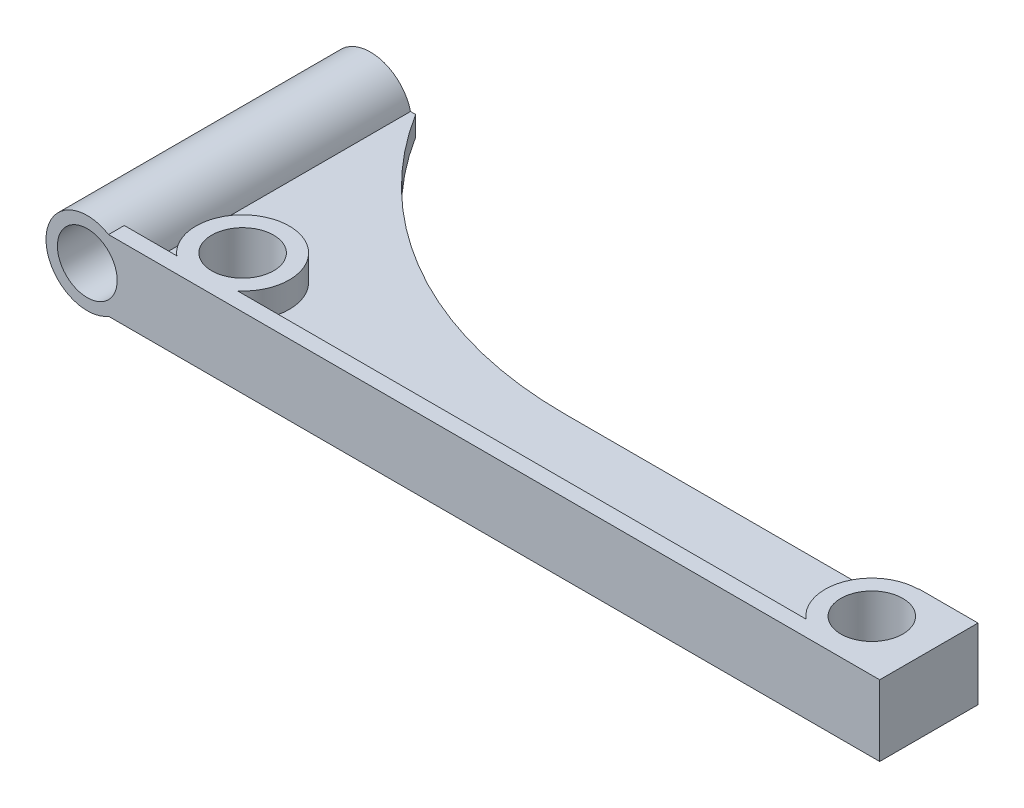
ISO-10303-21;
HEADER;
FILE_DESCRIPTION(('STEP AP214'),'2;1');
FILE_NAME('part.step','',(''),(''),'','','');
FILE_SCHEMA(('AUTOMOTIVE_DESIGN { 1 0 10303 214 1 1 1 1 }'));
ENDSEC;
DATA;
#1=APPLICATION_CONTEXT('core data for automotive mechanical design processes');
#2=APPLICATION_PROTOCOL_DEFINITION('international standard','automotive_design',2000,#1);
#3=PRODUCT_CONTEXT('',#1,'mechanical');
#4=PRODUCT('Part','Part','',(#3));
#5=PRODUCT_RELATED_PRODUCT_CATEGORY('part','',(#4));
#6=PRODUCT_DEFINITION_FORMATION('','',#4);
#7=PRODUCT_DEFINITION_CONTEXT('part definition',#1,'design');
#8=PRODUCT_DEFINITION('design','',#6,#7);
#9=PRODUCT_DEFINITION_SHAPE('','',#8);
#10=(LENGTH_UNIT() NAMED_UNIT(*) SI_UNIT(.MILLI.,.METRE.));
#11=(NAMED_UNIT(*) PLANE_ANGLE_UNIT() SI_UNIT($,.RADIAN.));
#12=(NAMED_UNIT(*) SI_UNIT($,.STERADIAN.) SOLID_ANGLE_UNIT());
#13=UNCERTAINTY_MEASURE_WITH_UNIT(LENGTH_MEASURE(1.E-05),#10,'distance_accuracy_value','');
#14=(GEOMETRIC_REPRESENTATION_CONTEXT(3) GLOBAL_UNCERTAINTY_ASSIGNED_CONTEXT((#13)) GLOBAL_UNIT_ASSIGNED_CONTEXT((#10,
#11,#12)) REPRESENTATION_CONTEXT('',''));
#15=CARTESIAN_POINT('',(0.,0.,0.));
#16=DIRECTION('',(0.,0.,1.));
#17=DIRECTION('',(1.,0.,0.));
#18=AXIS2_PLACEMENT_3D('',#15,#16,#17);
#19=CARTESIAN_POINT('',(0.,0.,-3.99999999999999));
#20=DIRECTION('',(0.,0.,-1.));
#21=DIRECTION('',(-1.,0.,0.));
#22=AXIS2_PLACEMENT_3D('',#19,#20,#21);
#23=PLANE('',#22);
#24=DIRECTION('',(0.,-1.,0.));
#25=VECTOR('',#24,1.);
#26=CARTESIAN_POINT('',(178.753024783827,9.,-3.99999999999999));
#27=LINE('',#26,#25);
#28=CARTESIAN_POINT('',(178.753024783827,2.5,-3.99999999999998));
#29=VERTEX_POINT('',#28);
#30=CARTESIAN_POINT('',(178.753024783827,9.,-3.99999999999998));
#31=VERTEX_POINT('',#30);
#32=EDGE_CURVE('E224',#29,#31,#27,.F.);
#33=ORIENTED_EDGE('',*,*,#32,.F.);
#34=DIRECTION('',(-1.,0.,0.));
#35=VECTOR('',#34,1.);
#36=CARTESIAN_POINT('',(0.,2.5,-3.99999999999999));
#37=LINE('',#36,#35);
#38=CARTESIAN_POINT('',(34.2469752161731,2.5,-3.99999999999999));
#39=VERTEX_POINT('',#38);
#40=EDGE_CURVE('E290',#29,#39,#37,.T.);
#41=ORIENTED_EDGE('',*,*,#40,.T.);
#42=DIRECTION('',(0.,-1.,0.));
#43=VECTOR('',#42,1.);
#44=CARTESIAN_POINT('',(34.2469752161731,9.,-3.99999999999999));
#45=LINE('',#44,#43);
#46=CARTESIAN_POINT('',(34.2469752161731,9.,-3.99999999999999));
#47=VERTEX_POINT('',#46);
#48=EDGE_CURVE('E12',#47,#39,#45,.T.);
#49=ORIENTED_EDGE('',*,*,#48,.F.);
#50=DIRECTION('',(1.,0.,0.));
#51=VECTOR('',#50,1.);
#52=CARTESIAN_POINT('',(0.,9.,-3.99999999999999));
#53=LINE('',#52,#51);
#54=EDGE_CURVE('E295',#47,#31,#53,.T.);
#55=ORIENTED_EDGE('',*,*,#54,.T.);
#56=EDGE_LOOP('',(#33,#41,#49,#55));
#57=FACE_BOUND('',#56,.T.);
#58=ADVANCED_FACE('F57',(#57),#23,.T.);
#59=CARTESIAN_POINT('',(0.,-2.5,-3.99999999999999));
#60=DIRECTION('',(0.,-1.,0.));
#61=DIRECTION('',(0.,0.,-1.));
#62=AXIS2_PLACEMENT_3D('',#59,#60,#61);
#63=PLANE('',#62);
#64=DIRECTION('',(-1.,0.,0.));
#65=VECTOR('',#64,1.);
#66=CARTESIAN_POINT('',(0.,-2.5,-25.));
#67=LINE('',#66,#65);
#68=CARTESIAN_POINT('',(186.5,-2.5,-25.));
#69=VERTEX_POINT('',#68);
#70=CARTESIAN_POINT('',(96.2997641506154,-2.5,-25.));
#71=VERTEX_POINT('',#70);
#72=EDGE_CURVE('E322',#69,#71,#67,.T.);
#73=ORIENTED_EDGE('',*,*,#72,.F.);
#74=DIRECTION('',(0.,0.,-1.));
#75=VECTOR('',#74,1.);
#76=CARTESIAN_POINT('',(186.5,-2.5,-25.));
#77=LINE('',#76,#75);
#78=CARTESIAN_POINT('',(186.5,-2.5,-24.875));
#79=VERTEX_POINT('',#78);
#80=EDGE_CURVE('E234',#79,#69,#77,.T.);
#81=ORIENTED_EDGE('',*,*,#80,.F.);
#82=CARTESIAN_POINT('',(186.5,-2.5,-13.));
#83=DIRECTION('',(0.,-1.,0.));
#84=DIRECTION('',(1.,0.,0.));
#85=AXIS2_PLACEMENT_3D('',#82,#83,#84);
#86=CIRCLE('',#85,11.875);
#87=CARTESIAN_POINT('',(178.753024783827,-2.5,-3.99999999999998));
#88=VERTEX_POINT('',#87);
#89=EDGE_CURVE('E250',#88,#79,#86,.T.);
#90=ORIENTED_EDGE('',*,*,#89,.F.);
#91=DIRECTION('',(-1.,0.,0.));
#92=VECTOR('',#91,1.);
#93=CARTESIAN_POINT('',(0.,-2.5,-3.99999999999999));
#94=LINE('',#93,#92);
#95=CARTESIAN_POINT('',(34.2469752161731,-2.5,-3.99999999999999));
#96=VERTEX_POINT('',#95);
#97=EDGE_CURVE('E276',#88,#96,#94,.T.);
#98=ORIENTED_EDGE('',*,*,#97,.T.);
#99=CARTESIAN_POINT('',(26.5,-2.5,-13.));
#100=DIRECTION('',(0.,-1.,0.));
#101=DIRECTION('',(1.,0.,0.));
#102=AXIS2_PLACEMENT_3D('',#99,#100,#101);
#103=CIRCLE('',#102,11.875);
#104=CARTESIAN_POINT('',(18.7530247838269,-2.5,-3.99999999999999));
#105=VERTEX_POINT('',#104);
#106=EDGE_CURVE('E262',#105,#96,#103,.T.);
#107=ORIENTED_EDGE('',*,*,#106,.F.);
#108=CARTESIAN_POINT('',(10.1980390271856,-2.5,-3.99999999999999));
#109=VERTEX_POINT('',#108);
#110=EDGE_CURVE('E279',#105,#109,#94,.T.);
#111=ORIENTED_EDGE('',*,*,#110,.T.);
#112=DIRECTION('',(0.,0.,-1.));
#113=VECTOR('',#112,1.);
#114=CARTESIAN_POINT('',(10.1980390271856,-2.5,-3.99999999999999));
#115=LINE('',#114,#113);
#116=CARTESIAN_POINT('',(10.1980390271856,-2.5,-72.));
#117=VERTEX_POINT('',#116);
#118=EDGE_CURVE('E285',#109,#117,#115,.T.);
#119=ORIENTED_EDGE('',*,*,#118,.T.);
#120=DIRECTION('',(-1.,0.,0.));
#121=VECTOR('',#120,1.);
#122=CARTESIAN_POINT('',(0.,-2.5,-72.));
#123=LINE('',#122,#121);
#124=CARTESIAN_POINT('',(11.5,-2.5,-72.));
#125=VERTEX_POINT('',#124);
#126=EDGE_CURVE('E273',#125,#117,#123,.T.);
#127=ORIENTED_EDGE('',*,*,#126,.F.);
#128=CARTESIAN_POINT('',(96.2997641506154,-2.5,-125.));
#129=DIRECTION('',(0.,-1.,0.));
#130=DIRECTION('',(0.,0.,-1.));
#131=AXIS2_PLACEMENT_3D('',#128,#129,#130);
#132=CIRCLE('',#131,100.);
#133=EDGE_CURVE('E326',#71,#125,#132,.T.);
#134=ORIENTED_EDGE('',*,*,#133,.F.);
#135=EDGE_LOOP('',(#73,#81,#90,#98,#107,#111,#119,#127,#134));
#136=FACE_BOUND('',#135,.T.);
#137=ADVANCED_FACE('F368',(#136),#63,.T.);
#138=CARTESIAN_POINT('',(186.5,-9.,-13.));
#139=DIRECTION('',(0.,1.,0.));
#140=DIRECTION('',(0.,0.,1.));
#141=AXIS2_PLACEMENT_3D('',#138,#139,#140);
#142=CYLINDRICAL_SURFACE('',#141,11.875);
#143=DIRECTION('',(0.,1.,0.));
#144=VECTOR('',#143,1.);
#145=CARTESIAN_POINT('',(186.5,-9.,-24.875));
#146=LINE('',#145,#144);
#147=CARTESIAN_POINT('',(186.5,-9.,-24.875));
#148=VERTEX_POINT('',#147);
#149=EDGE_CURVE('E245',#148,#79,#146,.T.);
#150=ORIENTED_EDGE('',*,*,#149,.F.);
#151=CARTESIAN_POINT('',(186.5,-9.,-13.));
#152=DIRECTION('',(0.,-1.,0.));
#153=DIRECTION('',(1.,0.,0.));
#154=AXIS2_PLACEMENT_3D('',#151,#152,#153);
#155=CIRCLE('',#154,11.875);
#156=CARTESIAN_POINT('',(178.753024783827,-9.,-3.99999999999998));
#157=VERTEX_POINT('',#156);
#158=EDGE_CURVE('E251',#157,#148,#155,.T.);
#159=ORIENTED_EDGE('',*,*,#158,.F.);
#160=DIRECTION('',(0.,1.,0.));
#161=VECTOR('',#160,1.);
#162=CARTESIAN_POINT('',(178.753024783827,-9.,-3.99999999999999));
#163=LINE('',#162,#161);
#164=EDGE_CURVE('E254',#88,#157,#163,.F.);
#165=ORIENTED_EDGE('',*,*,#164,.F.);
#166=ORIENTED_EDGE('',*,*,#89,.T.);
#167=EDGE_LOOP('',(#150,#159,#165,#166));
#168=FACE_BOUND('',#167,.T.);
#169=ADVANCED_FACE('F393',(#168),#142,.T.);
#170=CARTESIAN_POINT('',(0.,0.,-3.99999999999999));
#171=DIRECTION('',(0.,0.,-1.));
#172=DIRECTION('',(-1.,0.,0.));
#173=AXIS2_PLACEMENT_3D('',#170,#171,#172);
#174=PLANE('',#173);
#175=ORIENTED_EDGE('',*,*,#97,.F.);
#176=ORIENTED_EDGE('',*,*,#164,.T.);
#177=DIRECTION('',(1.,0.,0.));
#178=VECTOR('',#177,1.);
#179=CARTESIAN_POINT('',(0.,-9.,-3.99999999999999));
#180=LINE('',#179,#178);
#181=CARTESIAN_POINT('',(34.2469752161731,-9.,-3.99999999999999));
#182=VERTEX_POINT('',#181);
#183=EDGE_CURVE('E278',#182,#157,#180,.T.);
#184=ORIENTED_EDGE('',*,*,#183,.F.);
#185=DIRECTION('',(0.,1.,0.));
#186=VECTOR('',#185,1.);
#187=CARTESIAN_POINT('',(34.2469752161731,-9.,-3.99999999999999));
#188=LINE('',#187,#186);
#189=EDGE_CURVE('E328',#182,#96,#188,.T.);
#190=ORIENTED_EDGE('',*,*,#189,.T.);
#191=EDGE_LOOP('',(#175,#176,#184,#190));
#192=FACE_BOUND('',#191,.T.);
#193=ADVANCED_FACE('F452',(#192),#174,.T.);
#194=ORIENTED_EDGE('',*,*,#110,.F.);
#195=DIRECTION('',(0.,1.,0.));
#196=VECTOR('',#195,1.);
#197=CARTESIAN_POINT('',(18.7530247838269,-9.,-3.99999999999999));
#198=LINE('',#197,#196);
#199=CARTESIAN_POINT('',(18.7530247838269,-9.,-3.99999999999999));
#200=VERTEX_POINT('',#199);
#201=EDGE_CURVE('E331',#105,#200,#198,.F.);
#202=ORIENTED_EDGE('',*,*,#201,.T.);
#203=CARTESIAN_POINT('',(5.40832691319598,-9.,-3.99999999999999));
#204=VERTEX_POINT('',#203);
#205=EDGE_CURVE('E280',#204,#200,#180,.T.);
#206=ORIENTED_EDGE('',*,*,#205,.F.);
#207=CARTESIAN_POINT('',(0.,0.,-3.99999999999999));
#208=DIRECTION('',(0.,0.,1.));
#209=DIRECTION('',(-1.,0.,0.));
#210=AXIS2_PLACEMENT_3D('',#207,#208,#209);
#211=CIRCLE('',#210,10.5);
#212=EDGE_CURVE('E283',#109,#204,#211,.F.);
#213=ORIENTED_EDGE('',*,*,#212,.F.);
#214=EDGE_LOOP('',(#194,#202,#206,#213));
#215=FACE_BOUND('',#214,.T.);
#216=ADVANCED_FACE('F416',(#215),#174,.T.);
#217=CARTESIAN_POINT('',(0.,0.,-72.));
#218=DIRECTION('',(0.,0.,1.));
#219=DIRECTION('',(1.,0.,0.));
#220=AXIS2_PLACEMENT_3D('',#217,#218,#219);
#221=PLANE('',#220);
#222=CARTESIAN_POINT('',(0.,0.,-72.));
#223=DIRECTION('',(0.,0.,1.));
#224=DIRECTION('',(1.,0.,0.));
#225=AXIS2_PLACEMENT_3D('',#222,#223,#224);
#226=CIRCLE('',#225,7.6);
#227=CARTESIAN_POINT('',(7.6,0.,-72.));
#228=VERTEX_POINT('',#227);
#229=EDGE_CURVE('E313',#228,#228,#226,.T.);
#230=ORIENTED_EDGE('',*,*,#229,.T.);
#231=EDGE_LOOP('',(#230));
#232=FACE_BOUND('',#231,.T.);
#233=DIRECTION('',(-1.,0.,0.));
#234=VECTOR('',#233,1.);
#235=CARTESIAN_POINT('',(0.,2.5,-72.));
#236=LINE('',#235,#234);
#237=CARTESIAN_POINT('',(11.5,2.5,-72.));
#238=VERTEX_POINT('',#237);
#239=CARTESIAN_POINT('',(10.1980390271856,2.5,-72.));
#240=VERTEX_POINT('',#239);
#241=EDGE_CURVE('E289',#238,#240,#236,.T.);
#242=ORIENTED_EDGE('',*,*,#241,.F.);
#243=DIRECTION('',(0.,1.,0.));
#244=VECTOR('',#243,1.);
#245=CARTESIAN_POINT('',(11.5,-10.5,-72.));
#246=LINE('',#245,#244);
#247=EDGE_CURVE('E205',#125,#238,#246,.T.);
#248=ORIENTED_EDGE('',*,*,#247,.F.);
#249=ORIENTED_EDGE('',*,*,#126,.T.);
#250=CARTESIAN_POINT('',(0.,0.,-72.));
#251=DIRECTION('',(0.,0.,1.));
#252=DIRECTION('',(1.,0.,0.));
#253=AXIS2_PLACEMENT_3D('',#250,#251,#252);
#254=CIRCLE('',#253,10.5);
#255=EDGE_CURVE('E319',#240,#117,#254,.T.);
#256=ORIENTED_EDGE('',*,*,#255,.F.);
#257=EDGE_LOOP('',(#242,#248,#249,#256));
#258=FACE_BOUND('',#257,.T.);
#259=ADVANCED_FACE('F377',(#232,#258),#221,.F.);
#260=CARTESIAN_POINT('',(201.5,9.,-72.));
#261=DIRECTION('',(1.,0.,0.));
#262=DIRECTION('',(0.,0.,-1.));
#263=AXIS2_PLACEMENT_3D('',#260,#261,#262);
#264=PLANE('',#263);
#265=DIRECTION('',(0.,1.,0.));
#266=VECTOR('',#265,1.);
#267=CARTESIAN_POINT('',(201.5,-10.5,-25.));
#268=LINE('',#267,#266);
#269=CARTESIAN_POINT('',(201.5,-9.,-25.));
#270=VERTEX_POINT('',#269);
#271=CARTESIAN_POINT('',(201.5,9.,-25.));
#272=VERTEX_POINT('',#271);
#273=EDGE_CURVE('E200',#270,#272,#268,.T.);
#274=ORIENTED_EDGE('',*,*,#273,.T.);
#275=DIRECTION('',(0.,0.,1.));
#276=VECTOR('',#275,1.);
#277=CARTESIAN_POINT('',(201.5,9.,-72.));
#278=LINE('',#277,#276);
#279=CARTESIAN_POINT('',(201.5,9.,0.));
#280=VERTEX_POINT('',#279);
#281=EDGE_CURVE('E183',#272,#280,#278,.T.);
#282=ORIENTED_EDGE('',*,*,#281,.T.);
#283=DIRECTION('',(0.,1.,0.));
#284=VECTOR('',#283,1.);
#285=CARTESIAN_POINT('',(201.5,9.,0.));
#286=LINE('',#285,#284);
#287=CARTESIAN_POINT('',(201.5,-9.,0.));
#288=VERTEX_POINT('',#287);
#289=EDGE_CURVE('E305',#288,#280,#286,.T.);
#290=ORIENTED_EDGE('',*,*,#289,.F.);
#291=DIRECTION('',(0.,0.,1.));
#292=VECTOR('',#291,1.);
#293=CARTESIAN_POINT('',(201.5,-9.,-72.));
#294=LINE('',#293,#292);
#295=EDGE_CURVE('E197',#270,#288,#294,.T.);
#296=ORIENTED_EDGE('',*,*,#295,.F.);
#297=EDGE_LOOP('',(#274,#282,#290,#296));
#298=FACE_BOUND('',#297,.T.);
#299=ADVANCED_FACE('F201',(#298),#264,.T.);
#300=CARTESIAN_POINT('',(5.40832691319598,-9.,-72.));
#301=DIRECTION('',(0.,-1.,0.));
#302=DIRECTION('',(1.,0.,0.));
#303=AXIS2_PLACEMENT_3D('',#300,#301,#302);
#304=PLANE('',#303);
#305=DIRECTION('',(1.,0.,0.));
#306=VECTOR('',#305,1.);
#307=CARTESIAN_POINT('',(201.5,-9.,-25.));
#308=LINE('',#307,#306);
#309=CARTESIAN_POINT('',(186.5,-9.,-25.));
#310=VERTEX_POINT('',#309);
#311=EDGE_CURVE('E239',#310,#270,#308,.T.);
#312=ORIENTED_EDGE('',*,*,#311,.T.);
#313=ORIENTED_EDGE('',*,*,#295,.T.);
#314=DIRECTION('',(1.,0.,0.));
#315=VECTOR('',#314,1.);
#316=CARTESIAN_POINT('',(5.40832691319598,-9.,0.));
#317=LINE('',#316,#315);
#318=CARTESIAN_POINT('',(5.40832691319598,-9.,0.));
#319=VERTEX_POINT('',#318);
#320=EDGE_CURVE('E302',#319,#288,#317,.T.);
#321=ORIENTED_EDGE('',*,*,#320,.F.);
#322=DIRECTION('',(0.,0.,1.));
#323=VECTOR('',#322,1.);
#324=CARTESIAN_POINT('',(5.40832691319598,-9.,-72.));
#325=LINE('',#324,#323);
#326=EDGE_CURVE('E308',#204,#319,#325,.T.);
#327=ORIENTED_EDGE('',*,*,#326,.F.);
#328=ORIENTED_EDGE('',*,*,#205,.T.);
#329=CARTESIAN_POINT('',(26.5,-9.,-13.));
#330=DIRECTION('',(0.,-1.,0.));
#331=DIRECTION('',(1.,0.,0.));
#332=AXIS2_PLACEMENT_3D('',#329,#330,#331);
#333=CIRCLE('',#332,11.875);
#334=EDGE_CURVE('E263',#200,#182,#333,.T.);
#335=ORIENTED_EDGE('',*,*,#334,.T.);
#336=ORIENTED_EDGE('',*,*,#183,.T.);
#337=ORIENTED_EDGE('',*,*,#158,.T.);
#338=DIRECTION('',(0.,0.,-1.));
#339=VECTOR('',#338,1.);
#340=CARTESIAN_POINT('',(186.5,-9.,-25.));
#341=LINE('',#340,#339);
#342=EDGE_CURVE('E237',#148,#310,#341,.T.);
#343=ORIENTED_EDGE('',*,*,#342,.T.);
#344=EDGE_LOOP('',(#312,#313,#321,#327,#328,#335,#336,#337,#343));
#345=FACE_BOUND('',#344,.T.);
#346=CARTESIAN_POINT('',(26.5,-9.,-13.));
#347=DIRECTION('',(0.,-1.,0.));
#348=DIRECTION('',(0.,0.,-1.));
#349=AXIS2_PLACEMENT_3D('',#346,#347,#348);
#350=CIRCLE('',#349,7.875);
#351=CARTESIAN_POINT('',(26.5,-9.,-20.875));
#352=VERTEX_POINT('',#351);
#353=EDGE_CURVE('E259',#352,#352,#350,.T.);
#354=ORIENTED_EDGE('',*,*,#353,.F.);
#355=EDGE_LOOP('',(#354));
#356=FACE_BOUND('',#355,.T.);
#357=CARTESIAN_POINT('',(186.5,-9.,-13.));
#358=DIRECTION('',(0.,-1.,0.));
#359=DIRECTION('',(0.,0.,-1.));
#360=AXIS2_PLACEMENT_3D('',#357,#358,#359);
#361=CIRCLE('',#360,7.87500000000001);
#362=CARTESIAN_POINT('',(186.5,-9.,-20.875));
#363=VERTEX_POINT('',#362);
#364=EDGE_CURVE('E247',#363,#363,#361,.T.);
#365=ORIENTED_EDGE('',*,*,#364,.F.);
#366=EDGE_LOOP('',(#365));
#367=FACE_BOUND('',#366,.T.);
#368=ADVANCED_FACE('F359',(#345,#356,#367),#304,.T.);
#369=CARTESIAN_POINT('',(5.40832691319598,9.,-72.));
#370=DIRECTION('',(0.,1.,0.));
#371=DIRECTION('',(-1.,0.,0.));
#372=AXIS2_PLACEMENT_3D('',#369,#370,#371);
#373=PLANE('',#372);
#374=ORIENTED_EDGE('',*,*,#281,.F.);
#375=DIRECTION('',(1.,0.,0.));
#376=VECTOR('',#375,1.);
#377=CARTESIAN_POINT('',(201.5,9.,-25.));
#378=LINE('',#377,#376);
#379=CARTESIAN_POINT('',(186.5,9.,-25.));
#380=VERTEX_POINT('',#379);
#381=EDGE_CURVE('E189',#380,#272,#378,.T.);
#382=ORIENTED_EDGE('',*,*,#381,.F.);
#383=DIRECTION('',(0.,0.,-1.));
#384=VECTOR('',#383,1.);
#385=CARTESIAN_POINT('',(186.5,9.,-25.));
#386=LINE('',#385,#384);
#387=CARTESIAN_POINT('',(186.5,9.,-24.875));
#388=VERTEX_POINT('',#387);
#389=EDGE_CURVE('E211',#388,#380,#386,.T.);
#390=ORIENTED_EDGE('',*,*,#389,.F.);
#391=CARTESIAN_POINT('',(186.5,9.,-13.));
#392=DIRECTION('',(0.,-1.,0.));
#393=DIRECTION('',(1.,0.,0.));
#394=AXIS2_PLACEMENT_3D('',#391,#392,#393);
#395=CIRCLE('',#394,11.875);
#396=EDGE_CURVE('E222',#31,#388,#395,.T.);
#397=ORIENTED_EDGE('',*,*,#396,.F.);
#398=ORIENTED_EDGE('',*,*,#54,.F.);
#399=CARTESIAN_POINT('',(26.5,9.,-13.));
#400=DIRECTION('',(0.,-1.,0.));
#401=DIRECTION('',(1.,0.,0.));
#402=AXIS2_PLACEMENT_3D('',#399,#400,#401);
#403=CIRCLE('',#402,11.875);
#404=CARTESIAN_POINT('',(18.7530247838269,9.,-3.99999999999999));
#405=VERTEX_POINT('',#404);
#406=EDGE_CURVE('E231',#405,#47,#403,.T.);
#407=ORIENTED_EDGE('',*,*,#406,.F.);
#408=CARTESIAN_POINT('',(5.40832691319598,9.,-3.99999999999999));
#409=VERTEX_POINT('',#408);
#410=EDGE_CURVE('E296',#409,#405,#53,.T.);
#411=ORIENTED_EDGE('',*,*,#410,.F.);
#412=DIRECTION('',(0.,0.,1.));
#413=VECTOR('',#412,1.);
#414=CARTESIAN_POINT('',(5.40832691319598,9.,-72.));
#415=LINE('',#414,#413);
#416=CARTESIAN_POINT('',(5.40832691319598,9.,0.));
#417=VERTEX_POINT('',#416);
#418=EDGE_CURVE('E196',#409,#417,#415,.T.);
#419=ORIENTED_EDGE('',*,*,#418,.T.);
#420=DIRECTION('',(-1.,0.,0.));
#421=VECTOR('',#420,1.);
#422=CARTESIAN_POINT('',(5.40832691319598,9.,0.));
#423=LINE('',#422,#421);
#424=EDGE_CURVE('E192',#280,#417,#423,.T.);
#425=ORIENTED_EDGE('',*,*,#424,.F.);
#426=EDGE_LOOP('',(#374,#382,#390,#397,#398,#407,#411,#419,#425));
#427=FACE_BOUND('',#426,.T.);
#428=CARTESIAN_POINT('',(26.5,9.,-13.));
#429=DIRECTION('',(0.,-1.,0.));
#430=DIRECTION('',(0.,0.,-1.));
#431=AXIS2_PLACEMENT_3D('',#428,#429,#430);
#432=CIRCLE('',#431,7.875);
#433=CARTESIAN_POINT('',(26.5,9.,-20.875));
#434=VERTEX_POINT('',#433);
#435=EDGE_CURVE('E227',#434,#434,#432,.T.);
#436=ORIENTED_EDGE('',*,*,#435,.T.);
#437=EDGE_LOOP('',(#436));
#438=FACE_BOUND('',#437,.T.);
#439=CARTESIAN_POINT('',(186.5,9.,-13.));
#440=DIRECTION('',(0.,-1.,0.));
#441=DIRECTION('',(0.,0.,-1.));
#442=AXIS2_PLACEMENT_3D('',#439,#440,#441);
#443=CIRCLE('',#442,7.87500000000001);
#444=CARTESIAN_POINT('',(186.5,9.,-20.875));
#445=VERTEX_POINT('',#444);
#446=EDGE_CURVE('E218',#445,#445,#443,.T.);
#447=ORIENTED_EDGE('',*,*,#446,.T.);
#448=EDGE_LOOP('',(#447));
#449=FACE_BOUND('',#448,.T.);
#450=ADVANCED_FACE('F185',(#427,#438,#449),#373,.T.);
#451=CARTESIAN_POINT('',(0.,0.,-72.));
#452=DIRECTION('',(0.,0.,1.));
#453=DIRECTION('',(1.,0.,0.));
#454=AXIS2_PLACEMENT_3D('',#451,#452,#453);
#455=CYLINDRICAL_SURFACE('',#454,10.5);
#456=ORIENTED_EDGE('',*,*,#418,.F.);
#457=CARTESIAN_POINT('',(0.,0.,-3.99999999999999));
#458=DIRECTION('',(0.,0.,-1.));
#459=DIRECTION('',(-1.,0.,0.));
#460=AXIS2_PLACEMENT_3D('',#457,#458,#459);
#461=CIRCLE('',#460,10.5);
#462=CARTESIAN_POINT('',(10.1980390271856,2.5,-3.99999999999999));
#463=VERTEX_POINT('',#462);
#464=EDGE_CURVE('E292',#463,#409,#461,.F.);
#465=ORIENTED_EDGE('',*,*,#464,.F.);
#466=DIRECTION('',(0.,0.,-1.));
#467=VECTOR('',#466,1.);
#468=CARTESIAN_POINT('',(10.1980390271856,2.5,-3.99999999999999));
#469=LINE('',#468,#467);
#470=EDGE_CURVE('E298',#463,#240,#469,.T.);
#471=ORIENTED_EDGE('',*,*,#470,.T.);
#472=ORIENTED_EDGE('',*,*,#255,.T.);
#473=ORIENTED_EDGE('',*,*,#118,.F.);
#474=ORIENTED_EDGE('',*,*,#212,.T.);
#475=ORIENTED_EDGE('',*,*,#326,.T.);
#476=CARTESIAN_POINT('',(0.,0.,0.));
#477=DIRECTION('',(0.,0.,1.));
#478=DIRECTION('',(1.,0.,0.));
#479=AXIS2_PLACEMENT_3D('',#476,#477,#478);
#480=CIRCLE('',#479,10.5);
#481=EDGE_CURVE('E316',#417,#319,#480,.T.);
#482=ORIENTED_EDGE('',*,*,#481,.F.);
#483=EDGE_LOOP('',(#456,#465,#471,#472,#473,#474,#475,#482));
#484=FACE_BOUND('',#483,.T.);
#485=ADVANCED_FACE('F59',(#484),#455,.T.);
#486=CARTESIAN_POINT('',(0.,0.,0.));
#487=DIRECTION('',(0.,0.,1.));
#488=DIRECTION('',(1.,0.,0.));
#489=AXIS2_PLACEMENT_3D('',#486,#487,#488);
#490=PLANE('',#489);
#491=CARTESIAN_POINT('',(0.,0.,0.));
#492=DIRECTION('',(0.,0.,1.));
#493=DIRECTION('',(1.,0.,0.));
#494=AXIS2_PLACEMENT_3D('',#491,#492,#493);
#495=CIRCLE('',#494,7.6);
#496=CARTESIAN_POINT('',(7.6,0.,0.));
#497=VERTEX_POINT('',#496);
#498=EDGE_CURVE('E309',#497,#497,#495,.T.);
#499=ORIENTED_EDGE('',*,*,#498,.F.);
#500=EDGE_LOOP('',(#499));
#501=FACE_BOUND('',#500,.T.);
#502=ORIENTED_EDGE('',*,*,#481,.T.);
#503=ORIENTED_EDGE('',*,*,#320,.T.);
#504=ORIENTED_EDGE('',*,*,#289,.T.);
#505=ORIENTED_EDGE('',*,*,#424,.T.);
#506=EDGE_LOOP('',(#502,#503,#504,#505));
#507=FACE_BOUND('',#506,.T.);
#508=ADVANCED_FACE('F355',(#501,#507),#490,.T.);
#509=CARTESIAN_POINT('',(0.,0.,-72.));
#510=DIRECTION('',(0.,0.,1.));
#511=DIRECTION('',(1.,0.,0.));
#512=AXIS2_PLACEMENT_3D('',#509,#510,#511);
#513=CYLINDRICAL_SURFACE('',#512,7.6);
#514=ORIENTED_EDGE('',*,*,#229,.F.);
#515=EDGE_LOOP('',(#514));
#516=FACE_BOUND('',#515,.T.);
#517=ORIENTED_EDGE('',*,*,#498,.T.);
#518=EDGE_LOOP('',(#517));
#519=FACE_BOUND('',#518,.T.);
#520=ADVANCED_FACE('F402',(#516,#519),#513,.F.);
#521=CARTESIAN_POINT('',(0.,2.5,-3.99999999999999));
#522=DIRECTION('',(0.,-1.,0.));
#523=DIRECTION('',(0.,0.,-1.));
#524=AXIS2_PLACEMENT_3D('',#521,#522,#523);
#525=PLANE('',#524);
#526=CARTESIAN_POINT('',(186.5,2.5,-13.));
#527=DIRECTION('',(0.,-1.,0.));
#528=DIRECTION('',(1.,0.,0.));
#529=AXIS2_PLACEMENT_3D('',#526,#527,#528);
#530=CIRCLE('',#529,11.875);
#531=CARTESIAN_POINT('',(186.5,2.5,-24.875));
#532=VERTEX_POINT('',#531);
#533=EDGE_CURVE('E221',#29,#532,#530,.T.);
#534=ORIENTED_EDGE('',*,*,#533,.T.);
#535=DIRECTION('',(0.,0.,-1.));
#536=VECTOR('',#535,1.);
#537=CARTESIAN_POINT('',(186.5,2.5,-25.));
#538=LINE('',#537,#536);
#539=CARTESIAN_POINT('',(186.5,2.5,-25.));
#540=VERTEX_POINT('',#539);
#541=EDGE_CURVE('E72',#532,#540,#538,.T.);
#542=ORIENTED_EDGE('',*,*,#541,.T.);
#543=DIRECTION('',(1.,0.,0.));
#544=VECTOR('',#543,1.);
#545=CARTESIAN_POINT('',(96.2997641506154,2.5,-25.));
#546=LINE('',#545,#544);
#547=CARTESIAN_POINT('',(96.2997641506154,2.5,-25.));
#548=VERTEX_POINT('',#547);
#549=EDGE_CURVE('E271',#548,#540,#546,.T.);
#550=ORIENTED_EDGE('',*,*,#549,.F.);
#551=CARTESIAN_POINT('',(96.2997641506154,2.5,-125.));
#552=DIRECTION('',(0.,1.,0.));
#553=DIRECTION('',(0.,0.,1.));
#554=AXIS2_PLACEMENT_3D('',#551,#552,#553);
#555=CIRCLE('',#554,100.);
#556=EDGE_CURVE('E266',#238,#548,#555,.T.);
#557=ORIENTED_EDGE('',*,*,#556,.F.);
#558=ORIENTED_EDGE('',*,*,#241,.T.);
#559=ORIENTED_EDGE('',*,*,#470,.F.);
#560=CARTESIAN_POINT('',(18.7530247838269,2.5,-3.99999999999999));
#561=VERTEX_POINT('',#560);
#562=EDGE_CURVE('E293',#561,#463,#37,.T.);
#563=ORIENTED_EDGE('',*,*,#562,.F.);
#564=CARTESIAN_POINT('',(26.5,2.5,-13.));
#565=DIRECTION('',(0.,-1.,0.));
#566=DIRECTION('',(1.,0.,0.));
#567=AXIS2_PLACEMENT_3D('',#564,#565,#566);
#568=CIRCLE('',#567,11.875);
#569=EDGE_CURVE('E230',#561,#39,#568,.T.);
#570=ORIENTED_EDGE('',*,*,#569,.T.);
#571=ORIENTED_EDGE('',*,*,#40,.F.);
#572=EDGE_LOOP('',(#534,#542,#550,#557,#558,#559,#563,#570,#571));
#573=FACE_BOUND('',#572,.T.);
#574=ADVANCED_FACE('F348',(#573),#525,.F.);
#575=DIRECTION('',(0.,-1.,0.));
#576=VECTOR('',#575,1.);
#577=CARTESIAN_POINT('',(18.7530247838269,9.,-3.99999999999999));
#578=LINE('',#577,#576);
#579=EDGE_CURVE('E65',#561,#405,#578,.F.);
#580=ORIENTED_EDGE('',*,*,#579,.F.);
#581=ORIENTED_EDGE('',*,*,#562,.T.);
#582=ORIENTED_EDGE('',*,*,#464,.T.);
#583=ORIENTED_EDGE('',*,*,#410,.T.);
#584=EDGE_LOOP('',(#580,#581,#582,#583));
#585=FACE_BOUND('',#584,.T.);
#586=ADVANCED_FACE('F351',(#585),#23,.T.);
#587=CARTESIAN_POINT('',(96.2997641506154,-10.5,-125.));
#588=DIRECTION('',(0.,1.,0.));
#589=DIRECTION('',(0.,0.,1.));
#590=AXIS2_PLACEMENT_3D('',#587,#588,#589);
#591=CYLINDRICAL_SURFACE('',#590,100.);
#592=ORIENTED_EDGE('',*,*,#133,.T.);
#593=ORIENTED_EDGE('',*,*,#247,.T.);
#594=ORIENTED_EDGE('',*,*,#556,.T.);
#595=DIRECTION('',(0.,1.,0.));
#596=VECTOR('',#595,1.);
#597=CARTESIAN_POINT('',(96.2997641506154,-10.5,-25.));
#598=LINE('',#597,#596);
#599=EDGE_CURVE('E206',#71,#548,#598,.T.);
#600=ORIENTED_EDGE('',*,*,#599,.F.);
#601=EDGE_LOOP('',(#592,#593,#594,#600));
#602=FACE_BOUND('',#601,.T.);
#603=ADVANCED_FACE('F373',(#602),#591,.F.);
#604=CARTESIAN_POINT('',(96.2997641506154,-10.5,-25.));
#605=DIRECTION('',(0.,0.,1.));
#606=DIRECTION('',(1.,0.,0.));
#607=AXIS2_PLACEMENT_3D('',#604,#605,#606);
#608=PLANE('',#607);
#609=ORIENTED_EDGE('',*,*,#273,.F.);
#610=ORIENTED_EDGE('',*,*,#311,.F.);
#611=DIRECTION('',(0.,1.,0.));
#612=VECTOR('',#611,1.);
#613=CARTESIAN_POINT('',(186.5,-9.,-25.));
#614=LINE('',#613,#612);
#615=EDGE_CURVE('E241',#310,#69,#614,.T.);
#616=ORIENTED_EDGE('',*,*,#615,.T.);
#617=ORIENTED_EDGE('',*,*,#72,.T.);
#618=ORIENTED_EDGE('',*,*,#599,.T.);
#619=ORIENTED_EDGE('',*,*,#549,.T.);
#620=DIRECTION('',(0.,-1.,0.));
#621=VECTOR('',#620,1.);
#622=CARTESIAN_POINT('',(186.5,9.,-25.));
#623=LINE('',#622,#621);
#624=EDGE_CURVE('E210',#380,#540,#623,.T.);
#625=ORIENTED_EDGE('',*,*,#624,.F.);
#626=ORIENTED_EDGE('',*,*,#381,.T.);
#627=EDGE_LOOP('',(#609,#610,#616,#617,#618,#619,#625,#626));
#628=FACE_BOUND('',#627,.T.);
#629=ADVANCED_FACE('F208',(#628),#608,.F.);
#630=CARTESIAN_POINT('',(186.5,10.5,-13.));
#631=DIRECTION('',(0.,-1.,0.));
#632=DIRECTION('',(0.,0.,-1.));
#633=AXIS2_PLACEMENT_3D('',#630,#631,#632);
#634=CYLINDRICAL_SURFACE('',#633,7.875);
#635=ORIENTED_EDGE('',*,*,#364,.T.);
#636=EDGE_LOOP('',(#635));
#637=FACE_BOUND('',#636,.T.);
#638=ORIENTED_EDGE('',*,*,#446,.F.);
#639=EDGE_LOOP('',(#638));
#640=FACE_BOUND('',#639,.T.);
#641=ADVANCED_FACE('F519',(#637,#640),#634,.F.);
#642=CARTESIAN_POINT('',(26.5,10.5,-13.));
#643=DIRECTION('',(0.,-1.,0.));
#644=DIRECTION('',(0.,0.,-1.));
#645=AXIS2_PLACEMENT_3D('',#642,#643,#644);
#646=CYLINDRICAL_SURFACE('',#645,7.875);
#647=ORIENTED_EDGE('',*,*,#353,.T.);
#648=EDGE_LOOP('',(#647));
#649=FACE_BOUND('',#648,.T.);
#650=ORIENTED_EDGE('',*,*,#435,.F.);
#651=EDGE_LOOP('',(#650));
#652=FACE_BOUND('',#651,.T.);
#653=ADVANCED_FACE('F481',(#649,#652),#646,.F.);
#654=CARTESIAN_POINT('',(26.5,-9.,-13.));
#655=DIRECTION('',(0.,1.,0.));
#656=DIRECTION('',(0.,0.,1.));
#657=AXIS2_PLACEMENT_3D('',#654,#655,#656);
#658=CYLINDRICAL_SURFACE('',#657,11.875);
#659=ORIENTED_EDGE('',*,*,#201,.F.);
#660=ORIENTED_EDGE('',*,*,#106,.T.);
#661=ORIENTED_EDGE('',*,*,#189,.F.);
#662=ORIENTED_EDGE('',*,*,#334,.F.);
#663=EDGE_LOOP('',(#659,#660,#661,#662));
#664=FACE_BOUND('',#663,.T.);
#665=ADVANCED_FACE('F476',(#664),#658,.T.);
#666=CARTESIAN_POINT('',(186.5,-9.,-25.));
#667=DIRECTION('',(1.,0.,0.));
#668=DIRECTION('',(0.,0.,-1.));
#669=AXIS2_PLACEMENT_3D('',#666,#667,#668);
#670=PLANE('',#669);
#671=ORIENTED_EDGE('',*,*,#80,.T.);
#672=ORIENTED_EDGE('',*,*,#615,.F.);
#673=ORIENTED_EDGE('',*,*,#342,.F.);
#674=ORIENTED_EDGE('',*,*,#149,.T.);
#675=EDGE_LOOP('',(#671,#672,#673,#674));
#676=FACE_BOUND('',#675,.T.);
#677=ADVANCED_FACE('F480',(#676),#670,.F.);
#678=CARTESIAN_POINT('',(26.5,9.,-13.));
#679=DIRECTION('',(0.,-1.,0.));
#680=DIRECTION('',(0.,0.,-1.));
#681=AXIS2_PLACEMENT_3D('',#678,#679,#680);
#682=CYLINDRICAL_SURFACE('',#681,11.875);
#683=ORIENTED_EDGE('',*,*,#406,.T.);
#684=ORIENTED_EDGE('',*,*,#48,.T.);
#685=ORIENTED_EDGE('',*,*,#569,.F.);
#686=ORIENTED_EDGE('',*,*,#579,.T.);
#687=EDGE_LOOP('',(#683,#684,#685,#686));
#688=FACE_BOUND('',#687,.T.);
#689=ADVANCED_FACE('F337',(#688),#682,.T.);
#690=CARTESIAN_POINT('',(186.5,9.,-13.));
#691=DIRECTION('',(0.,-1.,0.));
#692=DIRECTION('',(0.,0.,-1.));
#693=AXIS2_PLACEMENT_3D('',#690,#691,#692);
#694=CYLINDRICAL_SURFACE('',#693,11.875);
#695=DIRECTION('',(0.,-1.,0.));
#696=VECTOR('',#695,1.);
#697=CARTESIAN_POINT('',(186.5,9.,-24.875));
#698=LINE('',#697,#696);
#699=EDGE_CURVE('E80',#388,#532,#698,.T.);
#700=ORIENTED_EDGE('',*,*,#699,.T.);
#701=ORIENTED_EDGE('',*,*,#533,.F.);
#702=ORIENTED_EDGE('',*,*,#32,.T.);
#703=ORIENTED_EDGE('',*,*,#396,.T.);
#704=EDGE_LOOP('',(#700,#701,#702,#703));
#705=FACE_BOUND('',#704,.T.);
#706=ADVANCED_FACE('F382',(#705),#694,.T.);
#707=CARTESIAN_POINT('',(186.5,9.,-25.));
#708=DIRECTION('',(-1.,0.,0.));
#709=DIRECTION('',(0.,0.,1.));
#710=AXIS2_PLACEMENT_3D('',#707,#708,#709);
#711=PLANE('',#710);
#712=ORIENTED_EDGE('',*,*,#541,.F.);
#713=ORIENTED_EDGE('',*,*,#699,.F.);
#714=ORIENTED_EDGE('',*,*,#389,.T.);
#715=ORIENTED_EDGE('',*,*,#624,.T.);
#716=EDGE_LOOP('',(#712,#713,#714,#715));
#717=FACE_BOUND('',#716,.T.);
#718=ADVANCED_FACE('F380',(#717),#711,.T.);
#719=CLOSED_SHELL('',(#58,#137,#169,#193,#216,#259,#299,#368,#450,#485,#508,#520,#574,#586,#603,
#629,#641,#653,#665,#677,#689,#706,#718));
#720=MANIFOLD_SOLID_BREP('B2',#719);
#721=ADVANCED_BREP_SHAPE_REPRESENTATION('',(#18,#720),#14);
#722=SHAPE_DEFINITION_REPRESENTATION(#9,#721);
ENDSEC;
END-ISO-10303-21;
